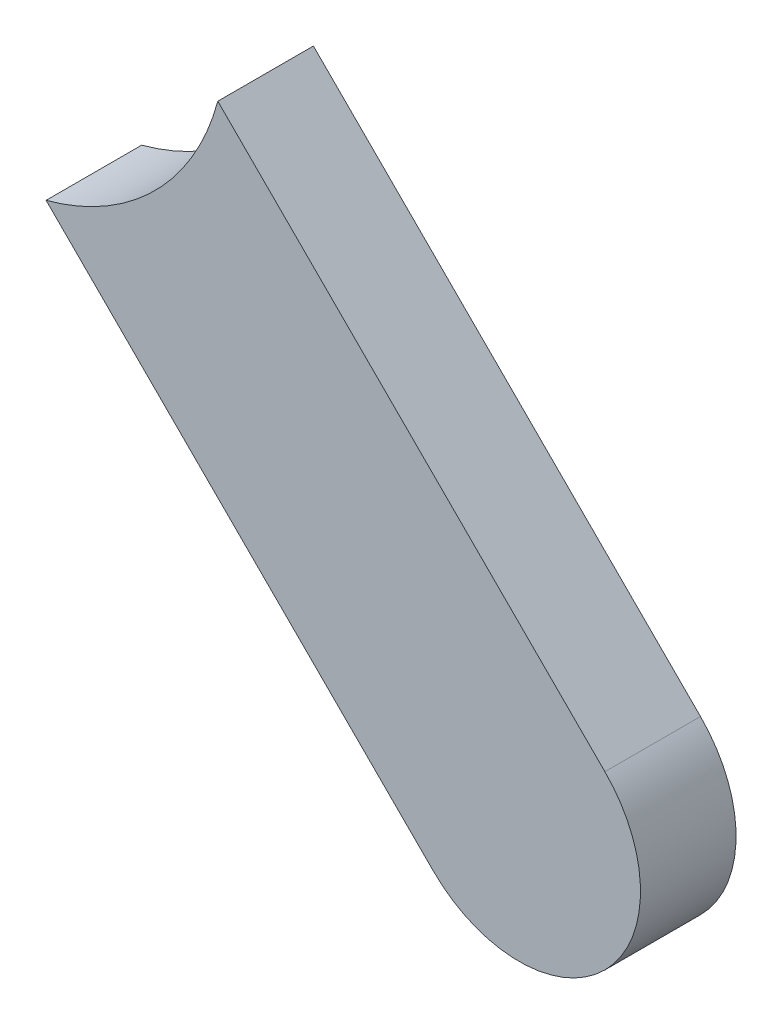
ISO-10303-21;
HEADER;
FILE_DESCRIPTION(('STEP AP214'),'2;1');
FILE_NAME('part.step','',(''),(''),'','','');
FILE_SCHEMA(('AUTOMOTIVE_DESIGN { 1 0 10303 214 1 1 1 1 }'));
ENDSEC;
DATA;
#1=APPLICATION_CONTEXT('core data for automotive mechanical design processes');
#2=APPLICATION_PROTOCOL_DEFINITION('international standard','automotive_design',2000,#1);
#3=PRODUCT_CONTEXT('',#1,'mechanical');
#4=PRODUCT('Part','Part','',(#3));
#5=PRODUCT_RELATED_PRODUCT_CATEGORY('part','',(#4));
#6=PRODUCT_DEFINITION_FORMATION('','',#4);
#7=PRODUCT_DEFINITION_CONTEXT('part definition',#1,'design');
#8=PRODUCT_DEFINITION('design','',#6,#7);
#9=PRODUCT_DEFINITION_SHAPE('','',#8);
#10=(LENGTH_UNIT() NAMED_UNIT(*) SI_UNIT(.MILLI.,.METRE.));
#11=(NAMED_UNIT(*) PLANE_ANGLE_UNIT() SI_UNIT($,.RADIAN.));
#12=(NAMED_UNIT(*) SI_UNIT($,.STERADIAN.) SOLID_ANGLE_UNIT());
#13=UNCERTAINTY_MEASURE_WITH_UNIT(LENGTH_MEASURE(1.E-05),#10,'distance_accuracy_value','');
#14=(GEOMETRIC_REPRESENTATION_CONTEXT(3) GLOBAL_UNCERTAINTY_ASSIGNED_CONTEXT((#13)) GLOBAL_UNIT_ASSIGNED_CONTEXT((#10,
#11,#12)) REPRESENTATION_CONTEXT('',''));
#15=CARTESIAN_POINT('',(0.,0.,0.));
#16=DIRECTION('',(0.,0.,1.));
#17=DIRECTION('',(1.,0.,0.));
#18=AXIS2_PLACEMENT_3D('',#15,#16,#17);
#19=CARTESIAN_POINT('',(90.3014807885386,54.6638350714614,0.));
#20=DIRECTION('',(0.707106781186545,0.70710678118655,0.));
#21=DIRECTION('',(0.70710678118655,-0.707106781186545,0.));
#22=AXIS2_PLACEMENT_3D('',#19,#20,#21);
#23=PLANE('',#22);
#24=DIRECTION('',(0.70710678118655,-0.707106781186545,0.));
#25=VECTOR('',#24,1.);
#26=CARTESIAN_POINT('',(89.9903966,54.97491926,0.1999996));
#27=LINE('',#26,#25);
#28=CARTESIAN_POINT('',(90.3014807885386,54.6638350714614,0.1999996));
#29=VERTEX_POINT('',#28);
#30=CARTESIAN_POINT('',(91.11141544,53.85390042,0.1999996));
#31=VERTEX_POINT('',#30);
#32=EDGE_CURVE('E11',#29,#31,#27,.T.);
#33=ORIENTED_EDGE('',*,*,#32,.F.);
#34=DIRECTION('',(0.,0.,1.));
#35=VECTOR('',#34,1.);
#36=CARTESIAN_POINT('',(90.3014807885386,54.6638350714614,0.));
#37=LINE('',#36,#35);
#38=CARTESIAN_POINT('',(90.3014807885386,54.6638350714614,0.));
#39=VERTEX_POINT('',#38);
#40=EDGE_CURVE('E24',#39,#29,#37,.T.);
#41=ORIENTED_EDGE('',*,*,#40,.F.);
#42=DIRECTION('',(0.70710678118655,-0.707106781186545,0.));
#43=VECTOR('',#42,1.);
#44=CARTESIAN_POINT('',(89.9903966,54.97491926,0.));
#45=LINE('',#44,#43);
#46=CARTESIAN_POINT('',(91.11141544,53.85390042,0.));
#47=VERTEX_POINT('',#46);
#48=EDGE_CURVE('E75',#39,#47,#45,.T.);
#49=ORIENTED_EDGE('',*,*,#48,.T.);
#50=DIRECTION('',(0.,0.,1.));
#51=VECTOR('',#50,1.);
#52=CARTESIAN_POINT('',(91.11141544,53.85390042,0.));
#53=LINE('',#52,#51);
#54=EDGE_CURVE('E37',#47,#31,#53,.T.);
#55=ORIENTED_EDGE('',*,*,#54,.T.);
#56=EDGE_LOOP('',(#33,#41,#49,#55));
#57=FACE_BOUND('',#56,.T.);
#58=ADVANCED_FACE('F17',(#57),#23,.F.);
#59=CARTESIAN_POINT('',(91.29102138,54.03350509,0.));
#60=DIRECTION('',(0.,0.,-1.));
#61=DIRECTION('',(-0.70710928117957,-0.707104281184686,0.));
#62=AXIS2_PLACEMENT_3D('',#59,#60,#61);
#63=CYLINDRICAL_SURFACE('',#62,0.254000258206741);
#64=CARTESIAN_POINT('',(91.29102138,54.03350509,0.1999996));
#65=DIRECTION('',(0.,0.,1.));
#66=DIRECTION('',(-0.70710928117957,-0.707104281184686,0.));
#67=AXIS2_PLACEMENT_3D('',#64,#65,#66);
#68=CIRCLE('',#67,0.254000258206741);
#69=CARTESIAN_POINT('',(91.47062732,54.21310976,0.1999996));
#70=VERTEX_POINT('',#69);
#71=EDGE_CURVE('E83',#31,#70,#68,.T.);
#72=ORIENTED_EDGE('',*,*,#71,.F.);
#73=ORIENTED_EDGE('',*,*,#54,.F.);
#74=CARTESIAN_POINT('',(91.29102138,54.03350509,0.));
#75=DIRECTION('',(0.,0.,1.));
#76=DIRECTION('',(-0.70710928117957,-0.707104281184686,0.));
#77=AXIS2_PLACEMENT_3D('',#74,#75,#76);
#78=CIRCLE('',#77,0.254000258206741);
#79=CARTESIAN_POINT('',(91.47062732,54.21310976,0.));
#80=VERTEX_POINT('',#79);
#81=EDGE_CURVE('E81',#47,#80,#78,.T.);
#82=ORIENTED_EDGE('',*,*,#81,.T.);
#83=DIRECTION('',(0.,0.,1.));
#84=VECTOR('',#83,1.);
#85=CARTESIAN_POINT('',(91.47062732,54.21310976,0.));
#86=LINE('',#85,#84);
#87=EDGE_CURVE('E67',#80,#70,#86,.T.);
#88=ORIENTED_EDGE('',*,*,#87,.T.);
#89=EDGE_LOOP('',(#72,#73,#82,#88));
#90=FACE_BOUND('',#89,.T.);
#91=ADVANCED_FACE('F89',(#90),#63,.T.);
#92=CARTESIAN_POINT('',(91.47062732,54.21310976,0.));
#93=DIRECTION('',(-0.70710678118655,-0.707106781186545,0.));
#94=DIRECTION('',(-0.707106781186545,0.70710678118655,0.));
#95=AXIS2_PLACEMENT_3D('',#92,#93,#94);
#96=PLANE('',#95);
#97=DIRECTION('',(-0.707106781186545,0.70710678118655,0.));
#98=VECTOR('',#97,1.);
#99=CARTESIAN_POINT('',(91.47062732,54.21310976,0.1999996));
#100=LINE('',#99,#98);
#101=CARTESIAN_POINT('',(90.6606906653028,55.0230464146972,0.1999996));
#102=VERTEX_POINT('',#101);
#103=EDGE_CURVE('E71',#70,#102,#100,.T.);
#104=ORIENTED_EDGE('',*,*,#103,.F.);
#105=ORIENTED_EDGE('',*,*,#87,.F.);
#106=DIRECTION('',(-0.707106781186545,0.70710678118655,0.));
#107=VECTOR('',#106,1.);
#108=CARTESIAN_POINT('',(91.47062732,54.21310976,0.));
#109=LINE('',#108,#107);
#110=CARTESIAN_POINT('',(90.6606906653028,55.0230464146972,0.));
#111=VERTEX_POINT('',#110);
#112=EDGE_CURVE('E63',#80,#111,#109,.T.);
#113=ORIENTED_EDGE('',*,*,#112,.T.);
#114=DIRECTION('',(0.,0.,1.));
#115=VECTOR('',#114,1.);
#116=CARTESIAN_POINT('',(90.6606906653028,55.0230464146972,0.));
#117=LINE('',#116,#115);
#118=EDGE_CURVE('E53',#111,#102,#117,.T.);
#119=ORIENTED_EDGE('',*,*,#118,.T.);
#120=EDGE_LOOP('',(#104,#105,#113,#119));
#121=FACE_BOUND('',#120,.T.);
#122=ADVANCED_FACE('F66',(#121),#96,.F.);
#123=CARTESIAN_POINT('',(90.17,55.1545252,0.));
#124=DIRECTION('',(0.,0.,-1.));
#125=DIRECTION('',(1.,0.,0.));
#126=AXIS2_PLACEMENT_3D('',#123,#124,#125);
#127=CYLINDRICAL_SURFACE('',#126,0.508);
#128=ORIENTED_EDGE('',*,*,#40,.T.);
#129=CARTESIAN_POINT('',(90.17,55.1545252,0.1999996));
#130=DIRECTION('',(0.,0.,1.));
#131=DIRECTION('',(1.,0.,0.));
#132=AXIS2_PLACEMENT_3D('',#129,#130,#131);
#133=CIRCLE('',#132,0.508);
#134=EDGE_CURVE('E59',#29,#102,#133,.T.);
#135=ORIENTED_EDGE('',*,*,#134,.T.);
#136=ORIENTED_EDGE('',*,*,#118,.F.);
#137=CARTESIAN_POINT('',(90.17,55.1545252,0.));
#138=DIRECTION('',(0.,0.,1.));
#139=DIRECTION('',(1.,0.,0.));
#140=AXIS2_PLACEMENT_3D('',#137,#138,#139);
#141=CIRCLE('',#140,0.508);
#142=EDGE_CURVE('E57',#39,#111,#141,.T.);
#143=ORIENTED_EDGE('',*,*,#142,.F.);
#144=EDGE_LOOP('',(#128,#135,#136,#143));
#145=FACE_BOUND('',#144,.T.);
#146=ADVANCED_FACE('F55',(#145),#127,.F.);
#147=CARTESIAN_POINT('',(89.9903966,54.97491926,0.));
#148=DIRECTION('',(0.,0.,-1.));
#149=DIRECTION('',(-1.,0.,0.));
#150=AXIS2_PLACEMENT_3D('',#147,#148,#149);
#151=PLANE('',#150);
#152=ORIENTED_EDGE('',*,*,#48,.F.);
#153=ORIENTED_EDGE('',*,*,#142,.T.);
#154=ORIENTED_EDGE('',*,*,#112,.F.);
#155=ORIENTED_EDGE('',*,*,#81,.F.);
#156=EDGE_LOOP('',(#152,#153,#154,#155));
#157=FACE_BOUND('',#156,.T.);
#158=ADVANCED_FACE('F74',(#157),#151,.T.);
#159=CARTESIAN_POINT('',(89.9903966,54.97491926,0.1999996));
#160=DIRECTION('',(0.,0.,-1.));
#161=DIRECTION('',(-1.,0.,0.));
#162=AXIS2_PLACEMENT_3D('',#159,#160,#161);
#163=PLANE('',#162);
#164=ORIENTED_EDGE('',*,*,#134,.F.);
#165=ORIENTED_EDGE('',*,*,#32,.T.);
#166=ORIENTED_EDGE('',*,*,#71,.T.);
#167=ORIENTED_EDGE('',*,*,#103,.T.);
#168=EDGE_LOOP('',(#164,#165,#166,#167));
#169=FACE_BOUND('',#168,.T.);
#170=ADVANCED_FACE('F91',(#169),#163,.F.);
#171=CLOSED_SHELL('',(#58,#91,#122,#146,#158,#170));
#172=MANIFOLD_SOLID_BREP('B1',#171);
#173=ADVANCED_BREP_SHAPE_REPRESENTATION('',(#18,#172),#14);
#174=SHAPE_DEFINITION_REPRESENTATION(#9,#173);
ENDSEC;
END-ISO-10303-21;
